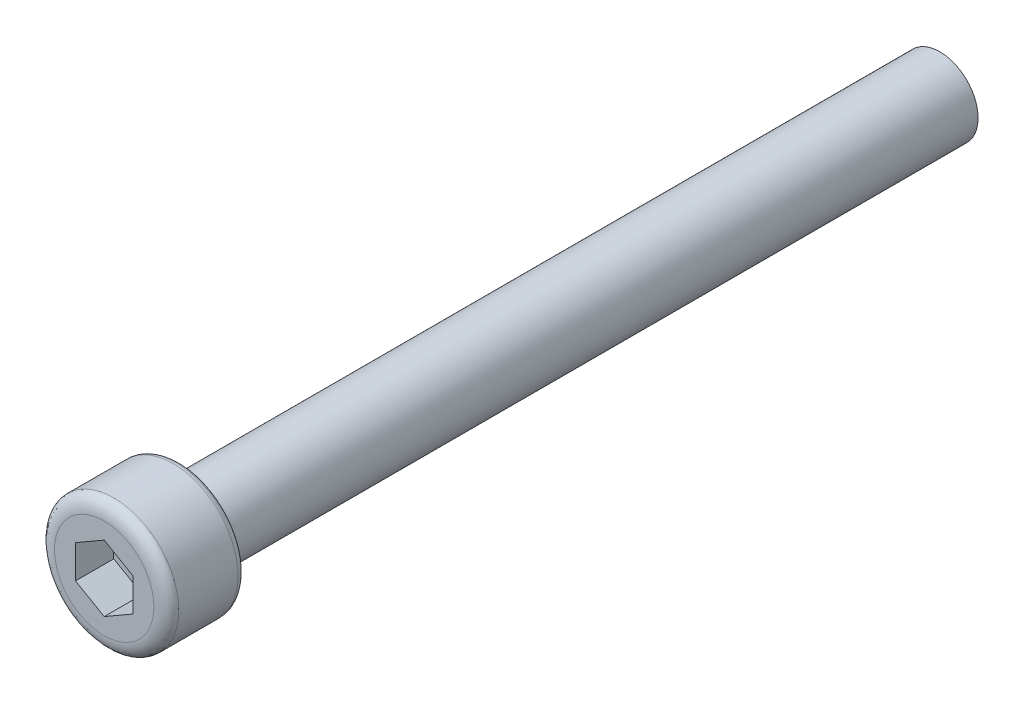
ISO-10303-21;
HEADER;
FILE_DESCRIPTION(('STEP AP214'),'2;1');
FILE_NAME('part.step','',(''),(''),'','','');
FILE_SCHEMA(('AUTOMOTIVE_DESIGN { 1 0 10303 214 1 1 1 1 }'));
ENDSEC;
DATA;
#1=APPLICATION_CONTEXT('core data for automotive mechanical design processes');
#2=APPLICATION_PROTOCOL_DEFINITION('international standard','automotive_design',2000,#1);
#3=PRODUCT_CONTEXT('',#1,'mechanical');
#4=PRODUCT('Part','Part','',(#3));
#5=PRODUCT_RELATED_PRODUCT_CATEGORY('part','',(#4));
#6=PRODUCT_DEFINITION_FORMATION('','',#4);
#7=PRODUCT_DEFINITION_CONTEXT('part definition',#1,'design');
#8=PRODUCT_DEFINITION('design','',#6,#7);
#9=PRODUCT_DEFINITION_SHAPE('','',#8);
#10=(LENGTH_UNIT() NAMED_UNIT(*) SI_UNIT(.MILLI.,.METRE.));
#11=(NAMED_UNIT(*) PLANE_ANGLE_UNIT() SI_UNIT($,.RADIAN.));
#12=(NAMED_UNIT(*) SI_UNIT($,.STERADIAN.) SOLID_ANGLE_UNIT());
#13=UNCERTAINTY_MEASURE_WITH_UNIT(LENGTH_MEASURE(1.E-05),#10,'distance_accuracy_value','');
#14=(GEOMETRIC_REPRESENTATION_CONTEXT(3) GLOBAL_UNCERTAINTY_ASSIGNED_CONTEXT((#13)) GLOBAL_UNIT_ASSIGNED_CONTEXT((#10,
#11,#12)) REPRESENTATION_CONTEXT('',''));
#15=CARTESIAN_POINT('',(0.,0.,0.));
#16=DIRECTION('',(0.,0.,1.));
#17=DIRECTION('',(1.,0.,0.));
#18=AXIS2_PLACEMENT_3D('',#15,#16,#17);
#19=CARTESIAN_POINT('',(0.,0.,22.));
#20=DIRECTION('',(0.,0.,1.));
#21=DIRECTION('',(1.,0.,0.));
#22=AXIS2_PLACEMENT_3D('',#19,#20,#21);
#23=PLANE('',#22);
#24=DIRECTION('',(-0.866025403784439,0.5,0.));
#25=VECTOR('',#24,1.);
#26=CARTESIAN_POINT('',(1.5,0.86602540378444,22.));
#27=LINE('',#26,#25);
#28=CARTESIAN_POINT('',(1.5,0.86602540378444,22.));
#29=VERTEX_POINT('',#28);
#30=CARTESIAN_POINT('',(0.,1.73205080756888,22.));
#31=VERTEX_POINT('',#30);
#32=EDGE_CURVE('E61',#29,#31,#27,.T.);
#33=ORIENTED_EDGE('',*,*,#32,.F.);
#34=DIRECTION('',(0.,1.,0.));
#35=VECTOR('',#34,1.);
#36=CARTESIAN_POINT('',(1.5,-0.866025403784439,22.));
#37=LINE('',#36,#35);
#38=CARTESIAN_POINT('',(1.5,-0.866025403784439,22.));
#39=VERTEX_POINT('',#38);
#40=EDGE_CURVE('E144',#39,#29,#37,.T.);
#41=ORIENTED_EDGE('',*,*,#40,.F.);
#42=DIRECTION('',(0.866025403784439,0.5,0.));
#43=VECTOR('',#42,1.);
#44=CARTESIAN_POINT('',(0.,-1.73205080756888,22.));
#45=LINE('',#44,#43);
#46=CARTESIAN_POINT('',(0.,-1.73205080756888,22.));
#47=VERTEX_POINT('',#46);
#48=EDGE_CURVE('E142',#47,#39,#45,.T.);
#49=ORIENTED_EDGE('',*,*,#48,.F.);
#50=DIRECTION('',(0.866025403784438,-0.5,0.));
#51=VECTOR('',#50,1.);
#52=CARTESIAN_POINT('',(-1.5,-0.866025403784438,22.));
#53=LINE('',#52,#51);
#54=CARTESIAN_POINT('',(-1.5,-0.866025403784438,22.));
#55=VERTEX_POINT('',#54);
#56=EDGE_CURVE('E109',#55,#47,#53,.T.);
#57=ORIENTED_EDGE('',*,*,#56,.F.);
#58=DIRECTION('',(0.,-1.,0.));
#59=VECTOR('',#58,1.);
#60=CARTESIAN_POINT('',(-1.5,0.866025403784439,22.));
#61=LINE('',#60,#59);
#62=CARTESIAN_POINT('',(-1.5,0.866025403784439,22.));
#63=VERTEX_POINT('',#62);
#64=EDGE_CURVE('E138',#63,#55,#61,.T.);
#65=ORIENTED_EDGE('',*,*,#64,.F.);
#66=DIRECTION('',(-0.866025403784439,-0.5,0.));
#67=VECTOR('',#66,1.);
#68=CARTESIAN_POINT('',(0.,1.73205080756888,22.));
#69=LINE('',#68,#67);
#70=EDGE_CURVE('E135',#31,#63,#69,.T.);
#71=ORIENTED_EDGE('',*,*,#70,.F.);
#72=EDGE_LOOP('',(#33,#41,#49,#57,#65,#71));
#73=FACE_BOUND('',#72,.T.);
#74=CARTESIAN_POINT('',(-2.6,0.,22.));
#75=CARTESIAN_POINT('',(-2.6,0.340339195747885,22.));
#76=CARTESIAN_POINT('',(-2.53232895612646,0.68054450708638,22.));
#77=CARTESIAN_POINT('',(-2.27184461293223,1.30940934121209,22.));
#78=CARTESIAN_POINT('',(-2.07913378430194,1.59782147786807,22.));
#79=CARTESIAN_POINT('',(-1.59782147786811,2.07913378430197,22.));
#80=CARTESIAN_POINT('',(-1.30940934121206,2.27184461293216,22.));
#81=CARTESIAN_POINT('',(-0.680544507086416,2.53232895612653,22.));
#82=CARTESIAN_POINT('',(-0.340339195747889,2.6,22.));
#83=CARTESIAN_POINT('',(0.340339195747889,2.6,22.));
#84=CARTESIAN_POINT('',(0.680544507086376,2.53232895612653,22.));
#85=CARTESIAN_POINT('',(1.30940934121209,2.27184461293216,22.));
#86=CARTESIAN_POINT('',(1.5978214778681,2.07913378430191,22.));
#87=CARTESIAN_POINT('',(2.07913378430195,1.59782147786813,22.));
#88=CARTESIAN_POINT('',(2.27184461293222,1.30940934121206,22.));
#89=CARTESIAN_POINT('',(2.53232895612648,0.680544507086402,22.));
#90=CARTESIAN_POINT('',(2.6,0.34033919574811,22.));
#91=CARTESIAN_POINT('',(2.6,-0.340339195748119,22.));
#92=CARTESIAN_POINT('',(2.5323289561267,-0.680544507086188,22.));
#93=CARTESIAN_POINT('',(2.27184461293199,-1.30940934121229,22.));
#94=CARTESIAN_POINT('',(2.0791337843018,-1.59782147786829,22.));
#95=CARTESIAN_POINT('',(1.59782147786825,-2.07913378430177,22.));
#96=CARTESIAN_POINT('',(1.30940934121224,-2.27184461293216,22.));
#97=CARTESIAN_POINT('',(0.680544507086231,-2.53232895612654,22.));
#98=CARTESIAN_POINT('',(0.340339195748087,-2.60000000000001,22.));
#99=CARTESIAN_POINT('',(-0.340339195748083,-2.60000000000001,22.));
#100=CARTESIAN_POINT('',(-0.680544507086233,-2.53232895612669,22.));
#101=CARTESIAN_POINT('',(-1.30940934121224,-2.27184461293202,22.));
#102=CARTESIAN_POINT('',(-1.59782147786815,-2.07913378430195,22.));
#103=CARTESIAN_POINT('',(-2.0791337843019,-1.59782147786812,22.));
#104=CARTESIAN_POINT('',(-2.27184461293216,-1.30940934121205,22.));
#105=CARTESIAN_POINT('',(-2.53232895612654,-0.680544507086418,22.));
#106=CARTESIAN_POINT('',(-2.6,-0.340339195747893,22.));
#107=CARTESIAN_POINT('',(-2.6,0.,22.));
#108=(BOUNDED_CURVE() B_SPLINE_CURVE(3,(#74,#75,#76,#77,#78,#79,#80,#81,#82,#83,#84,#85,#86,#87,
#88,#89,#90,#91,#92,#93,#94,#95,#96,#97,#98,#99,#100,#101,#102,#103,#104,#105,#106,#107),
.UNSPECIFIED.,.T.,.F.) B_SPLINE_CURVE_WITH_KNOTS((4,2,2,2,2,2,2,2,2,2,2,2,2,2,2,2,4),
(-3.14159265358979,-2.74889357189107,-2.35619449019234,-1.96349540849362,-1.5707963267949,
-1.17809724509617,-0.785398163397448,-0.392699081698724,0.,0.392699081698724,0.785398163397448,
1.17809724509617,1.5707963267949,1.96349540849362,2.35619449019234,2.74889357189107,
3.14159265358979),
.UNSPECIFIED.) CURVE() GEOMETRIC_REPRESENTATION_ITEM() RATIONAL_B_SPLINE_CURVE((1.,1.,1.,1.,1.,
1.,1.,1.,1.,1.,1.,1.,1.,1.,1.,1.,1.,1.,1.,1.,1.,1.,1.,1.,1.,1.,1.,1.,1.,1.,1.,1.,1.,1.)) REPRESENTATION_ITEM(''));
#109=CARTESIAN_POINT('',(-2.6,0.,22.));
#110=VERTEX_POINT('',#109);
#111=EDGE_CURVE('E12',#110,#110,#108,.F.);
#112=ORIENTED_EDGE('',*,*,#111,.T.);
#113=EDGE_LOOP('',(#112));
#114=FACE_BOUND('',#113,.T.);
#115=ADVANCED_FACE('F40',(#73,#114),#23,.T.);
#116=CARTESIAN_POINT('',(0.,0.,-22.));
#117=DIRECTION('',(0.,0.,-1.));
#118=DIRECTION('',(-1.,0.,0.));
#119=AXIS2_PLACEMENT_3D('',#116,#117,#118);
#120=CYLINDRICAL_SURFACE('',#119,3.4);
#121=CARTESIAN_POINT('',(-3.4,0.,21.5));
#122=CARTESIAN_POINT('',(-3.4,-0.445058948285704,21.5));
#123=CARTESIAN_POINT('',(-3.31150709647316,-0.889942816959115,21.5));
#124=CARTESIAN_POINT('',(-2.9708737246036,-1.7123045231235,21.5));
#125=CARTESIAN_POINT('',(-2.71886725639486,-2.08945885567367,21.5));
#126=CARTESIAN_POINT('',(-2.08945885567367,-2.71886725639486,21.5));
#127=CARTESIAN_POINT('',(-1.71230452312372,-2.97087372460351,21.5));
#128=CARTESIAN_POINT('',(-0.889942816958902,-3.31150709647325,21.5));
#129=CARTESIAN_POINT('',(-0.445058948285955,-3.40000000000001,21.5));
#130=CARTESIAN_POINT('',(0.44505894828596,-3.40000000000001,21.5));
#131=CARTESIAN_POINT('',(0.88994281695895,-3.31150709647323,21.5));
#132=CARTESIAN_POINT('',(1.71230452312366,-2.97087372460353,21.5));
#133=CARTESIAN_POINT('',(2.08945885567385,-2.71886725639468,21.5));
#134=CARTESIAN_POINT('',(2.71886725639468,-2.08945885567385,21.5));
#135=CARTESIAN_POINT('',(2.97087372460348,-1.71230452312378,21.5));
#136=CARTESIAN_POINT('',(3.31150709647327,-0.889942816958841,21.5));
#137=CARTESIAN_POINT('',(3.4,-0.445058948286,21.5));
#138=CARTESIAN_POINT('',(3.4,0.445058948285992,21.5));
#139=CARTESIAN_POINT('',(3.31150709647314,0.889942816959164,21.5));
#140=CARTESIAN_POINT('',(2.97087372460362,1.71230452312344,21.5));
#141=CARTESIAN_POINT('',(2.71886725639483,2.0894588556737,21.5));
#142=CARTESIAN_POINT('',(2.0894588556737,2.71886725639482,21.5));
#143=CARTESIAN_POINT('',(1.7123045231235,2.97087372460359,21.5));
#144=CARTESIAN_POINT('',(0.889942816959106,3.31150709647316,21.5));
#145=CARTESIAN_POINT('',(0.445058948285701,3.4,21.5));
#146=CARTESIAN_POINT('',(-0.4450589482857,3.4,21.5));
#147=CARTESIAN_POINT('',(-0.889942816959166,3.31150709647314,21.5));
#148=CARTESIAN_POINT('',(-1.71230452312345,2.97087372460361,21.5));
#149=CARTESIAN_POINT('',(-2.08945885567367,2.71886725639485,21.5));
#150=CARTESIAN_POINT('',(-2.71886725639486,2.08945885567366,21.5));
#151=CARTESIAN_POINT('',(-2.9708737246036,1.71230452312347,21.5));
#152=CARTESIAN_POINT('',(-3.31150709647315,0.889942816959143,21.5));
#153=CARTESIAN_POINT('',(-3.4,0.445058948285697,21.5));
#154=CARTESIAN_POINT('',(-3.4,0.,21.5));
#155=(BOUNDED_CURVE() B_SPLINE_CURVE(3,(#121,#122,#123,#124,#125,#126,#127,#128,#129,#130,#131,
#132,#133,#134,#135,#136,#137,#138,#139,#140,#141,#142,#143,#144,#145,#146,#147,#148,#149,#150,
#151,#152,#153,#154),.UNSPECIFIED.,.T.,.F.) B_SPLINE_CURVE_WITH_KNOTS((4,2,2,2,2,2,2,2,2,2,2,2,
2,2,2,2,4),(-3.14159265358979,-2.74889357189107,-2.35619449019234,-1.96349540849362,
-1.5707963267949,-1.17809724509617,-0.785398163397448,-0.392699081698724,0.,0.392699081698724,
0.785398163397448,1.17809724509617,1.5707963267949,1.96349540849362,2.35619449019234,
2.74889357189107,3.14159265358979),
.UNSPECIFIED.) CURVE() GEOMETRIC_REPRESENTATION_ITEM() RATIONAL_B_SPLINE_CURVE((1.,1.,1.,1.,1.,
1.,1.,1.,1.,1.,1.,1.,1.,1.,1.,1.,1.,1.,1.,1.,1.,1.,1.,1.,1.,1.,1.,1.,1.,1.,1.,1.,1.,1.)) REPRESENTATION_ITEM(''));
#156=CARTESIAN_POINT('',(-3.4,0.,21.5));
#157=VERTEX_POINT('',#156);
#158=EDGE_CURVE('E54',#157,#157,#155,.F.);
#159=ORIENTED_EDGE('',*,*,#158,.T.);
#160=EDGE_LOOP('',(#159));
#161=FACE_BOUND('',#160,.T.);
#162=CARTESIAN_POINT('',(0.,0.,18.4));
#163=DIRECTION('',(0.,0.,-1.));
#164=DIRECTION('',(-1.,0.,0.));
#165=AXIS2_PLACEMENT_3D('',#162,#163,#164);
#166=CIRCLE('',#165,3.4);
#167=CARTESIAN_POINT('',(-3.4,0.,18.4));
#168=VERTEX_POINT('',#167);
#169=EDGE_CURVE('E165',#168,#168,#166,.F.);
#170=ORIENTED_EDGE('',*,*,#169,.T.);
#171=EDGE_LOOP('',(#170));
#172=FACE_BOUND('',#171,.T.);
#173=ADVANCED_FACE('F177',(#161,#172),#120,.T.);
#174=CARTESIAN_POINT('',(0.,3.4,18.));
#175=DIRECTION('',(0.,0.,-1.));
#176=DIRECTION('',(-1.,0.,0.));
#177=AXIS2_PLACEMENT_3D('',#174,#175,#176);
#178=PLANE('',#177);
#179=CARTESIAN_POINT('',(0.,0.,18.));
#180=DIRECTION('',(0.,0.,-1.));
#181=DIRECTION('',(-1.,0.,0.));
#182=AXIS2_PLACEMENT_3D('',#179,#180,#181);
#183=CIRCLE('',#182,3.);
#184=CARTESIAN_POINT('',(-3.,0.,18.));
#185=VERTEX_POINT('',#184);
#186=EDGE_CURVE('E162',#185,#185,#183,.T.);
#187=ORIENTED_EDGE('',*,*,#186,.T.);
#188=EDGE_LOOP('',(#187));
#189=FACE_BOUND('',#188,.T.);
#190=CARTESIAN_POINT('',(0.,0.,18.));
#191=DIRECTION('',(0.,0.,-1.));
#192=DIRECTION('',(-1.,0.,0.));
#193=AXIS2_PLACEMENT_3D('',#190,#191,#192);
#194=CIRCLE('',#193,2.00000000000001);
#195=CARTESIAN_POINT('',(-2.00000000000001,0.,18.));
#196=VERTEX_POINT('',#195);
#197=EDGE_CURVE('E148',#196,#196,#194,.T.);
#198=ORIENTED_EDGE('',*,*,#197,.F.);
#199=EDGE_LOOP('',(#198));
#200=FACE_BOUND('',#199,.T.);
#201=ADVANCED_FACE('F187',(#189,#200),#178,.T.);
#202=CARTESIAN_POINT('',(0.,0.,-22.));
#203=DIRECTION('',(0.,0.,-1.));
#204=DIRECTION('',(-1.,0.,0.));
#205=AXIS2_PLACEMENT_3D('',#202,#203,#204);
#206=CYLINDRICAL_SURFACE('',#205,2.00000000000001);
#207=CARTESIAN_POINT('',(0.,0.,-21.7));
#208=DIRECTION('',(0.,0.,-1.));
#209=DIRECTION('',(-1.,0.,0.));
#210=AXIS2_PLACEMENT_3D('',#207,#208,#209);
#211=CIRCLE('',#210,2.00000000000001);
#212=CARTESIAN_POINT('',(-2.00000000000001,0.,-21.7));
#213=VERTEX_POINT('',#212);
#214=EDGE_CURVE('E159',#213,#213,#211,.F.);
#215=ORIENTED_EDGE('',*,*,#214,.T.);
#216=EDGE_LOOP('',(#215));
#217=FACE_BOUND('',#216,.T.);
#218=ORIENTED_EDGE('',*,*,#197,.T.);
#219=EDGE_LOOP('',(#218));
#220=FACE_BOUND('',#219,.T.);
#221=ADVANCED_FACE('F236',(#217,#220),#206,.T.);
#222=CARTESIAN_POINT('',(0.,2.,-22.));
#223=DIRECTION('',(0.,0.,-1.));
#224=DIRECTION('',(-1.,0.,0.));
#225=AXIS2_PLACEMENT_3D('',#222,#223,#224);
#226=PLANE('',#225);
#227=CARTESIAN_POINT('',(0.,0.,-22.));
#228=DIRECTION('',(0.,0.,-1.));
#229=DIRECTION('',(-1.,0.,0.));
#230=AXIS2_PLACEMENT_3D('',#227,#228,#229);
#231=CIRCLE('',#230,1.48038475772934);
#232=CARTESIAN_POINT('',(-1.48038475772934,0.,-22.));
#233=VERTEX_POINT('',#232);
#234=EDGE_CURVE('E156',#233,#233,#231,.T.);
#235=ORIENTED_EDGE('',*,*,#234,.T.);
#236=EDGE_LOOP('',(#235));
#237=FACE_BOUND('',#236,.T.);
#238=ADVANCED_FACE('F228',(#237),#226,.T.);
#239=CARTESIAN_POINT('',(0.,0.,-22.));
#240=DIRECTION('',(0.,0.,1.));
#241=DIRECTION('',(1.,0.,0.));
#242=AXIS2_PLACEMENT_3D('',#239,#240,#241);
#243=CONICAL_SURFACE('',#242,1.48038475772934,1.0471975511966);
#244=ORIENTED_EDGE('',*,*,#214,.F.);
#245=EDGE_LOOP('',(#244));
#246=FACE_BOUND('',#245,.T.);
#247=ORIENTED_EDGE('',*,*,#234,.F.);
#248=EDGE_LOOP('',(#247));
#249=FACE_BOUND('',#248,.T.);
#250=ADVANCED_FACE('F194',(#246,#249),#243,.T.);
#251=CARTESIAN_POINT('',(0.,0.,18.4));
#252=DIRECTION('',(0.,0.,-1.));
#253=DIRECTION('',(-1.,0.,0.));
#254=AXIS2_PLACEMENT_3D('',#251,#252,#253);
#255=TOROIDAL_SURFACE('',#254,3.,0.4);
#256=ORIENTED_EDGE('',*,*,#169,.F.);
#257=EDGE_LOOP('',(#256));
#258=FACE_BOUND('',#257,.T.);
#259=ORIENTED_EDGE('',*,*,#186,.F.);
#260=EDGE_LOOP('',(#259));
#261=FACE_BOUND('',#260,.T.);
#262=ADVANCED_FACE('F217',(#258,#261),#255,.T.);
#263=CARTESIAN_POINT('',(-2.6,0.,22.));
#264=CARTESIAN_POINT('',(-2.6,-0.340339195747893,22.));
#265=CARTESIAN_POINT('',(-2.53232895612654,-0.680544507086418,22.));
#266=CARTESIAN_POINT('',(-2.27184461293216,-1.30940934121205,22.));
#267=CARTESIAN_POINT('',(-2.0791337843019,-1.59782147786812,22.));
#268=CARTESIAN_POINT('',(-1.59782147786815,-2.07913378430195,22.));
#269=CARTESIAN_POINT('',(-1.30940934121224,-2.27184461293202,22.));
#270=CARTESIAN_POINT('',(-0.680544507086233,-2.53232895612669,22.));
#271=CARTESIAN_POINT('',(-0.340339195748083,-2.60000000000001,22.));
#272=CARTESIAN_POINT('',(0.340339195748087,-2.60000000000001,22.));
#273=CARTESIAN_POINT('',(0.680544507086231,-2.53232895612654,22.));
#274=CARTESIAN_POINT('',(1.30940934121224,-2.27184461293216,22.));
#275=CARTESIAN_POINT('',(1.59782147786825,-2.07913378430177,22.));
#276=CARTESIAN_POINT('',(2.0791337843018,-1.59782147786829,22.));
#277=CARTESIAN_POINT('',(2.27184461293199,-1.30940934121229,22.));
#278=CARTESIAN_POINT('',(2.5323289561267,-0.680544507086188,22.));
#279=CARTESIAN_POINT('',(2.6,-0.340339195748119,22.));
#280=CARTESIAN_POINT('',(2.6,0.34033919574811,22.));
#281=CARTESIAN_POINT('',(2.53232895612648,0.680544507086402,22.));
#282=CARTESIAN_POINT('',(2.27184461293222,1.30940934121206,22.));
#283=CARTESIAN_POINT('',(2.07913378430195,1.59782147786813,22.));
#284=CARTESIAN_POINT('',(1.5978214778681,2.07913378430191,22.));
#285=CARTESIAN_POINT('',(1.30940934121209,2.27184461293216,22.));
#286=CARTESIAN_POINT('',(0.680544507086376,2.53232895612653,22.));
#287=CARTESIAN_POINT('',(0.340339195747889,2.6,22.));
#288=CARTESIAN_POINT('',(-0.340339195747889,2.6,22.));
#289=CARTESIAN_POINT('',(-0.680544507086416,2.53232895612653,22.));
#290=CARTESIAN_POINT('',(-1.30940934121206,2.27184461293216,22.));
#291=CARTESIAN_POINT('',(-1.59782147786811,2.07913378430197,22.));
#292=CARTESIAN_POINT('',(-2.07913378430194,1.59782147786807,22.));
#293=CARTESIAN_POINT('',(-2.27184461293223,1.30940934121209,22.));
#294=CARTESIAN_POINT('',(-2.53232895612646,0.68054450708638,22.));
#295=CARTESIAN_POINT('',(-2.6,0.340339195747885,22.));
#296=CARTESIAN_POINT('',(-2.6,0.,22.));
#297=CARTESIAN_POINT('',(-3.4,0.,22.));
#298=CARTESIAN_POINT('',(-3.4,-0.445058948285704,22.));
#299=CARTESIAN_POINT('',(-3.31150709647319,-0.889942816959127,22.));
#300=CARTESIAN_POINT('',(-2.97087372460357,-1.71230452312349,22.));
#301=CARTESIAN_POINT('',(-2.71886725639486,-2.08945885567367,22.));
#302=CARTESIAN_POINT('',(-2.08945885567367,-2.71886725639487,22.));
#303=CARTESIAN_POINT('',(-1.7123045231237,-2.97087372460338,22.));
#304=CARTESIAN_POINT('',(-0.889942816958927,-3.31150709647339,22.));
#305=CARTESIAN_POINT('',(-0.445058948285955,-3.40000000000001,22.));
#306=CARTESIAN_POINT('',(0.44505894828596,-3.40000000000001,22.));
#307=CARTESIAN_POINT('',(0.889942816958923,-3.31150709647317,22.));
#308=CARTESIAN_POINT('',(1.71230452312369,-2.9708737246036,22.));
#309=CARTESIAN_POINT('',(2.08945885567393,-2.71886725639468,22.));
#310=CARTESIAN_POINT('',(2.71886725639461,-2.08945885567385,22.));
#311=CARTESIAN_POINT('',(2.97087372460342,-1.71230452312375,22.));
#312=CARTESIAN_POINT('',(3.31150709647334,-0.889942816958866,22.));
#313=CARTESIAN_POINT('',(3.4,-0.445058948286,22.));
#314=CARTESIAN_POINT('',(3.4,0.445058948285992,22.));
#315=CARTESIAN_POINT('',(3.31150709647311,0.889942816959117,22.));
#316=CARTESIAN_POINT('',(2.97087372460365,1.71230452312349,22.));
#317=CARTESIAN_POINT('',(2.71886725639483,2.0894588556737,22.));
#318=CARTESIAN_POINT('',(2.0894588556737,2.71886725639482,22.));
#319=CARTESIAN_POINT('',(1.71230452312351,2.97087372460352,22.));
#320=CARTESIAN_POINT('',(0.889942816959106,3.31150709647323,22.));
#321=CARTESIAN_POINT('',(0.445058948285701,3.4,22.));
#322=CARTESIAN_POINT('',(-0.445058948285701,3.4,22.));
#323=CARTESIAN_POINT('',(-0.889942816959145,3.31150709647316,22.));
#324=CARTESIAN_POINT('',(-1.71230452312347,2.97087372460359,22.));
#325=CARTESIAN_POINT('',(-2.0894588556736,2.71886725639493,22.));
#326=CARTESIAN_POINT('',(-2.71886725639494,2.08945885567359,22.));
#327=CARTESIAN_POINT('',(-2.97087372460372,1.71230452312349,22.));
#328=CARTESIAN_POINT('',(-3.31150709647304,0.889942816959128,22.));
#329=CARTESIAN_POINT('',(-3.4,0.445058948285697,22.));
#330=CARTESIAN_POINT('',(-3.4,0.,22.));
#331=CARTESIAN_POINT('',(-3.4,0.,21.5));
#332=CARTESIAN_POINT('',(-3.4,-0.445058948285704,21.5));
#333=CARTESIAN_POINT('',(-3.31150709647316,-0.889942816959115,21.5));
#334=CARTESIAN_POINT('',(-2.9708737246036,-1.7123045231235,21.5));
#335=CARTESIAN_POINT('',(-2.71886725639486,-2.08945885567367,21.5));
#336=CARTESIAN_POINT('',(-2.08945885567367,-2.71886725639486,21.5));
#337=CARTESIAN_POINT('',(-1.71230452312372,-2.97087372460351,21.5));
#338=CARTESIAN_POINT('',(-0.889942816958902,-3.31150709647325,21.5));
#339=CARTESIAN_POINT('',(-0.445058948285955,-3.40000000000001,21.5));
#340=CARTESIAN_POINT('',(0.44505894828596,-3.40000000000001,21.5));
#341=CARTESIAN_POINT('',(0.88994281695895,-3.31150709647323,21.5));
#342=CARTESIAN_POINT('',(1.71230452312366,-2.97087372460353,21.5));
#343=CARTESIAN_POINT('',(2.08945885567385,-2.71886725639468,21.5));
#344=CARTESIAN_POINT('',(2.71886725639468,-2.08945885567385,21.5));
#345=CARTESIAN_POINT('',(2.97087372460348,-1.71230452312378,21.5));
#346=CARTESIAN_POINT('',(3.31150709647327,-0.889942816958841,21.5));
#347=CARTESIAN_POINT('',(3.4,-0.445058948286,21.5));
#348=CARTESIAN_POINT('',(3.4,0.445058948285992,21.5));
#349=CARTESIAN_POINT('',(3.31150709647314,0.889942816959164,21.5));
#350=CARTESIAN_POINT('',(2.97087372460362,1.71230452312344,21.5));
#351=CARTESIAN_POINT('',(2.71886725639483,2.0894588556737,21.5));
#352=CARTESIAN_POINT('',(2.0894588556737,2.71886725639482,21.5));
#353=CARTESIAN_POINT('',(1.7123045231235,2.97087372460359,21.5));
#354=CARTESIAN_POINT('',(0.889942816959106,3.31150709647316,21.5));
#355=CARTESIAN_POINT('',(0.445058948285701,3.4,21.5));
#356=CARTESIAN_POINT('',(-0.4450589482857,3.4,21.5));
#357=CARTESIAN_POINT('',(-0.889942816959166,3.31150709647314,21.5));
#358=CARTESIAN_POINT('',(-1.71230452312345,2.97087372460361,21.5));
#359=CARTESIAN_POINT('',(-2.08945885567367,2.71886725639485,21.5));
#360=CARTESIAN_POINT('',(-2.71886725639486,2.08945885567366,21.5));
#361=CARTESIAN_POINT('',(-2.9708737246036,1.71230452312347,21.5));
#362=CARTESIAN_POINT('',(-3.31150709647315,0.889942816959143,21.5));
#363=CARTESIAN_POINT('',(-3.4,0.445058948285697,21.5));
#364=CARTESIAN_POINT('',(-3.4,0.,21.5));
#365=(BOUNDED_SURFACE() B_SPLINE_SURFACE(2,3,((#263,#264,#265,#266,#267,#268,#269,#270,#271,
#272,#273,#274,#275,#276,#277,#278,#279,#280,#281,#282,#283,#284,#285,#286,#287,#288,#289,#290,
#291,#292,#293,#294,#295,#296),(#297,#298,#299,#300,#301,#302,#303,#304,#305,#306,#307,#308,
#309,#310,#311,#312,#313,#314,#315,#316,#317,#318,#319,#320,#321,#322,#323,#324,#325,#326,#327,
#328,#329,#330),(#331,#332,#333,#334,#335,#336,#337,#338,#339,#340,#341,#342,#343,#344,#345,
#346,#347,#348,#349,#350,#351,#352,#353,#354,#355,#356,#357,#358,#359,#360,#361,#362,#363,
#364)),.UNSPECIFIED.,.F.,.T.,.F.) B_SPLINE_SURFACE_WITH_KNOTS((3,3),(4,2,2,2,2,2,2,2,2,2,2,2,2,
2,2,2,4),(0.,1.),(-3.14159265358979,-2.74889357189107,-2.35619449019234,-1.96349540849362,
-1.5707963267949,-1.17809724509617,-0.785398163397448,-0.392699081698724,0.,0.392699081698724,
0.785398163397448,1.17809724509617,1.5707963267949,1.96349540849362,2.35619449019234,
2.74889357189107,3.14159265358979),
.UNSPECIFIED.) GEOMETRIC_REPRESENTATION_ITEM() RATIONAL_B_SPLINE_SURFACE(((1.,1.,1.,1.,1.,1.,1.,
1.,1.,1.,1.,1.,1.,1.,1.,1.,1.,1.,1.,1.,1.,1.,1.,1.,1.,1.,1.,1.,1.,1.,1.,1.,1.,1.),
(0.707106781186546,0.707106781186546,0.707106781186546,0.707106781186546,0.707106781186546,
0.707106781186546,0.707106781186546,0.707106781186546,0.707106781186546,0.707106781186546,
0.707106781186546,0.707106781186546,0.707106781186546,0.707106781186546,0.707106781186546,
0.707106781186546,0.707106781186546,0.707106781186546,0.707106781186546,0.707106781186546,
0.707106781186546,0.707106781186546,0.707106781186546,0.707106781186546,0.707106781186546,
0.707106781186546,0.707106781186546,0.707106781186546,0.707106781186546,0.707106781186546,
0.707106781186546,0.707106781186546,0.707106781186546,0.707106781186546),(1.,1.,1.,1.,1.,1.,1.,
1.,1.,1.,1.,1.,1.,1.,1.,1.,1.,1.,1.,1.,1.,1.,1.,1.,1.,1.,1.,1.,1.,1.,1.,1.,1.,1.))) REPRESENTATION_ITEM('') SURFACE());
#366=ORIENTED_EDGE('',*,*,#111,.F.);
#367=EDGE_LOOP('',(#366));
#368=FACE_BOUND('',#367,.T.);
#369=ORIENTED_EDGE('',*,*,#158,.F.);
#370=EDGE_LOOP('',(#369));
#371=FACE_BOUND('',#370,.T.);
#372=ADVANCED_FACE('F43',(#368,#371),#365,.T.);
#373=CARTESIAN_POINT('',(1.5,0.86602540378444,20.));
#374=DIRECTION('',(0.5,0.866025403784439,0.));
#375=DIRECTION('',(-0.866025403784439,0.5,0.));
#376=AXIS2_PLACEMENT_3D('',#373,#374,#375);
#377=PLANE('',#376);
#378=ORIENTED_EDGE('',*,*,#32,.T.);
#379=DIRECTION('',(0.,0.,1.));
#380=VECTOR('',#379,1.);
#381=CARTESIAN_POINT('',(0.,1.73205080756888,20.));
#382=LINE('',#381,#380);
#383=CARTESIAN_POINT('',(0.,1.73205080756888,20.));
#384=VERTEX_POINT('',#383);
#385=EDGE_CURVE('E91',#384,#31,#382,.T.);
#386=ORIENTED_EDGE('',*,*,#385,.F.);
#387=DIRECTION('',(-0.866025403784439,0.5,0.));
#388=VECTOR('',#387,1.);
#389=CARTESIAN_POINT('',(1.5,0.86602540378444,20.));
#390=LINE('',#389,#388);
#391=CARTESIAN_POINT('',(1.5,0.86602540378444,20.));
#392=VERTEX_POINT('',#391);
#393=EDGE_CURVE('E146',#392,#384,#390,.T.);
#394=ORIENTED_EDGE('',*,*,#393,.F.);
#395=DIRECTION('',(0.,0.,1.));
#396=VECTOR('',#395,1.);
#397=CARTESIAN_POINT('',(1.5,0.86602540378444,20.));
#398=LINE('',#397,#396);
#399=EDGE_CURVE('E69',#392,#29,#398,.T.);
#400=ORIENTED_EDGE('',*,*,#399,.T.);
#401=EDGE_LOOP('',(#378,#386,#394,#400));
#402=FACE_BOUND('',#401,.T.);
#403=ADVANCED_FACE('F216',(#402),#377,.F.);
#404=CARTESIAN_POINT('',(1.5,-0.866025403784439,20.));
#405=DIRECTION('',(1.,0.,0.));
#406=DIRECTION('',(0.,0.,-1.));
#407=AXIS2_PLACEMENT_3D('',#404,#405,#406);
#408=PLANE('',#407);
#409=ORIENTED_EDGE('',*,*,#40,.T.);
#410=ORIENTED_EDGE('',*,*,#399,.F.);
#411=DIRECTION('',(0.,1.,0.));
#412=VECTOR('',#411,1.);
#413=CARTESIAN_POINT('',(1.5,-0.866025403784439,20.));
#414=LINE('',#413,#412);
#415=CARTESIAN_POINT('',(1.5,-0.866025403784439,20.));
#416=VERTEX_POINT('',#415);
#417=EDGE_CURVE('E121',#416,#392,#414,.T.);
#418=ORIENTED_EDGE('',*,*,#417,.F.);
#419=DIRECTION('',(0.,0.,1.));
#420=VECTOR('',#419,1.);
#421=CARTESIAN_POINT('',(1.5,-0.866025403784439,20.));
#422=LINE('',#421,#420);
#423=EDGE_CURVE('E113',#416,#39,#422,.T.);
#424=ORIENTED_EDGE('',*,*,#423,.T.);
#425=EDGE_LOOP('',(#409,#410,#418,#424));
#426=FACE_BOUND('',#425,.T.);
#427=ADVANCED_FACE('F222',(#426),#408,.F.);
#428=CARTESIAN_POINT('',(0.,-1.73205080756888,20.));
#429=DIRECTION('',(0.5,-0.866025403784439,0.));
#430=DIRECTION('',(0.866025403784439,0.5,0.));
#431=AXIS2_PLACEMENT_3D('',#428,#429,#430);
#432=PLANE('',#431);
#433=ORIENTED_EDGE('',*,*,#48,.T.);
#434=ORIENTED_EDGE('',*,*,#423,.F.);
#435=DIRECTION('',(0.866025403784439,0.5,0.));
#436=VECTOR('',#435,1.);
#437=CARTESIAN_POINT('',(0.,-1.73205080756888,20.));
#438=LINE('',#437,#436);
#439=CARTESIAN_POINT('',(0.,-1.73205080756888,20.));
#440=VERTEX_POINT('',#439);
#441=EDGE_CURVE('E117',#440,#416,#438,.T.);
#442=ORIENTED_EDGE('',*,*,#441,.F.);
#443=DIRECTION('',(0.,0.,1.));
#444=VECTOR('',#443,1.);
#445=CARTESIAN_POINT('',(0.,-1.73205080756888,20.));
#446=LINE('',#445,#444);
#447=EDGE_CURVE('E102',#440,#47,#446,.T.);
#448=ORIENTED_EDGE('',*,*,#447,.T.);
#449=EDGE_LOOP('',(#433,#434,#442,#448));
#450=FACE_BOUND('',#449,.T.);
#451=ADVANCED_FACE('F118',(#450),#432,.F.);
#452=CARTESIAN_POINT('',(-1.5,-0.866025403784438,20.));
#453=DIRECTION('',(-0.5,-0.866025403784439,0.));
#454=DIRECTION('',(0.866025403784439,-0.5,0.));
#455=AXIS2_PLACEMENT_3D('',#452,#453,#454);
#456=PLANE('',#455);
#457=ORIENTED_EDGE('',*,*,#56,.T.);
#458=ORIENTED_EDGE('',*,*,#447,.F.);
#459=DIRECTION('',(0.866025403784438,-0.5,0.));
#460=VECTOR('',#459,1.);
#461=CARTESIAN_POINT('',(-1.5,-0.866025403784438,20.));
#462=LINE('',#461,#460);
#463=CARTESIAN_POINT('',(-1.5,-0.866025403784438,20.));
#464=VERTEX_POINT('',#463);
#465=EDGE_CURVE('E106',#464,#440,#462,.T.);
#466=ORIENTED_EDGE('',*,*,#465,.F.);
#467=DIRECTION('',(0.,0.,1.));
#468=VECTOR('',#467,1.);
#469=CARTESIAN_POINT('',(-1.5,-0.866025403784438,20.));
#470=LINE('',#469,#468);
#471=EDGE_CURVE('E114',#464,#55,#470,.T.);
#472=ORIENTED_EDGE('',*,*,#471,.T.);
#473=EDGE_LOOP('',(#457,#458,#466,#472));
#474=FACE_BOUND('',#473,.T.);
#475=ADVANCED_FACE('F104',(#474),#456,.F.);
#476=CARTESIAN_POINT('',(-1.5,0.866025403784439,20.));
#477=DIRECTION('',(-1.,0.,0.));
#478=DIRECTION('',(0.,0.,1.));
#479=AXIS2_PLACEMENT_3D('',#476,#477,#478);
#480=PLANE('',#479);
#481=ORIENTED_EDGE('',*,*,#64,.T.);
#482=ORIENTED_EDGE('',*,*,#471,.F.);
#483=DIRECTION('',(0.,-1.,0.));
#484=VECTOR('',#483,1.);
#485=CARTESIAN_POINT('',(-1.5,0.866025403784439,20.));
#486=LINE('',#485,#484);
#487=CARTESIAN_POINT('',(-1.5,0.866025403784439,20.));
#488=VERTEX_POINT('',#487);
#489=EDGE_CURVE('E127',#488,#464,#486,.T.);
#490=ORIENTED_EDGE('',*,*,#489,.F.);
#491=DIRECTION('',(0.,0.,1.));
#492=VECTOR('',#491,1.);
#493=CARTESIAN_POINT('',(-1.5,0.866025403784439,20.));
#494=LINE('',#493,#492);
#495=EDGE_CURVE('E151',#488,#63,#494,.T.);
#496=ORIENTED_EDGE('',*,*,#495,.T.);
#497=EDGE_LOOP('',(#481,#482,#490,#496));
#498=FACE_BOUND('',#497,.T.);
#499=ADVANCED_FACE('F250',(#498),#480,.F.);
#500=CARTESIAN_POINT('',(0.,1.73205080756888,20.));
#501=DIRECTION('',(-0.5,0.866025403784439,0.));
#502=DIRECTION('',(-0.866025403784439,-0.5,0.));
#503=AXIS2_PLACEMENT_3D('',#500,#501,#502);
#504=PLANE('',#503);
#505=ORIENTED_EDGE('',*,*,#70,.T.);
#506=ORIENTED_EDGE('',*,*,#495,.F.);
#507=DIRECTION('',(-0.866025403784439,-0.5,0.));
#508=VECTOR('',#507,1.);
#509=CARTESIAN_POINT('',(0.,1.73205080756888,20.));
#510=LINE('',#509,#508);
#511=EDGE_CURVE('E129',#384,#488,#510,.T.);
#512=ORIENTED_EDGE('',*,*,#511,.F.);
#513=ORIENTED_EDGE('',*,*,#385,.T.);
#514=EDGE_LOOP('',(#505,#506,#512,#513));
#515=FACE_BOUND('',#514,.T.);
#516=ADVANCED_FACE('F247',(#515),#504,.F.);
#517=CARTESIAN_POINT('',(0.,0.,20.));
#518=DIRECTION('',(0.,0.,1.));
#519=DIRECTION('',(1.,0.,0.));
#520=AXIS2_PLACEMENT_3D('',#517,#518,#519);
#521=PLANE('',#520);
#522=ORIENTED_EDGE('',*,*,#393,.T.);
#523=ORIENTED_EDGE('',*,*,#511,.T.);
#524=ORIENTED_EDGE('',*,*,#489,.T.);
#525=ORIENTED_EDGE('',*,*,#465,.T.);
#526=ORIENTED_EDGE('',*,*,#441,.T.);
#527=ORIENTED_EDGE('',*,*,#417,.T.);
#528=EDGE_LOOP('',(#522,#523,#524,#525,#526,#527));
#529=FACE_BOUND('',#528,.T.);
#530=ADVANCED_FACE('F124',(#529),#521,.T.);
#531=CLOSED_SHELL('',(#115,#173,#201,#221,#238,#250,#262,#372,#403,#427,#451,#475,#499,#516,#530));
#532=MANIFOLD_SOLID_BREP('B2',#531);
#533=ADVANCED_BREP_SHAPE_REPRESENTATION('',(#18,#532),#14);
#534=SHAPE_DEFINITION_REPRESENTATION(#9,#533);
ENDSEC;
END-ISO-10303-21;
